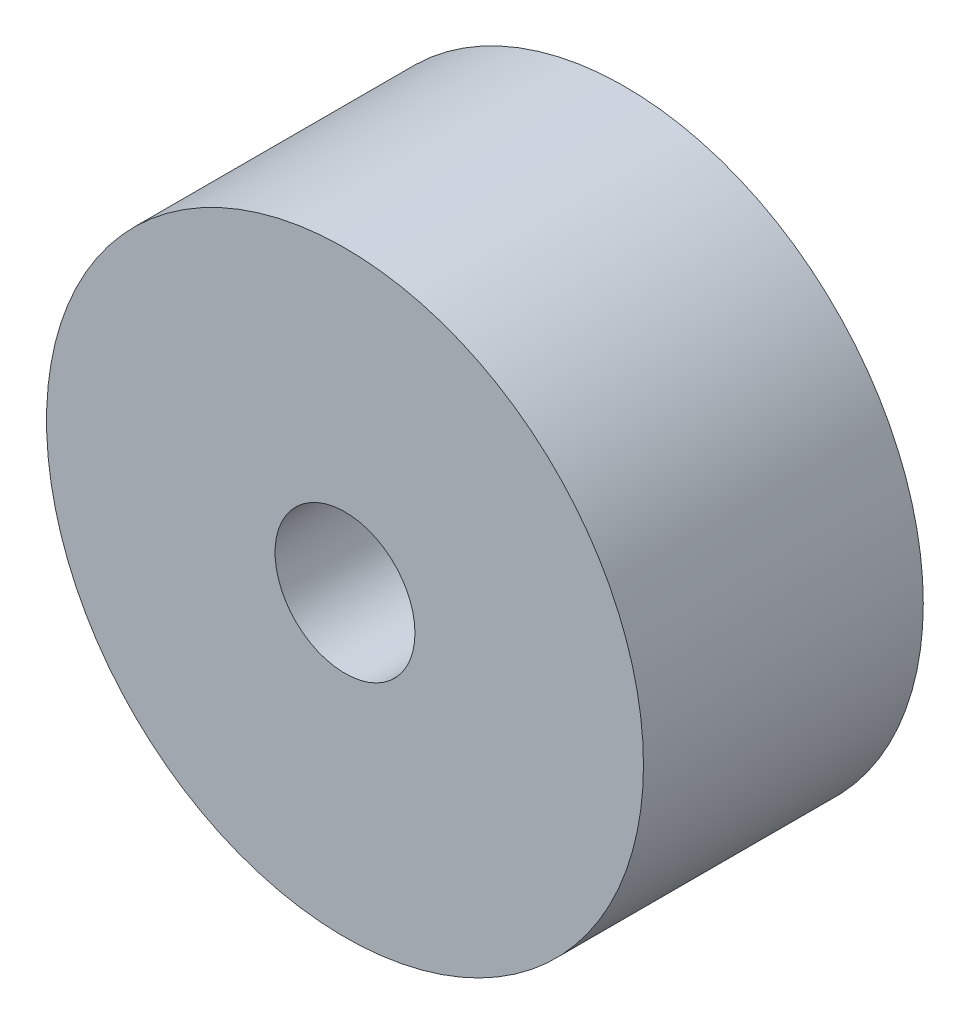
ISO-10303-21;
HEADER;
FILE_DESCRIPTION(('STEP AP214'),'2;1');
FILE_NAME('part.step','',(''),(''),'','','');
FILE_SCHEMA(('AUTOMOTIVE_DESIGN { 1 0 10303 214 1 1 1 1 }'));
ENDSEC;
DATA;
#1=APPLICATION_CONTEXT('core data for automotive mechanical design processes');
#2=APPLICATION_PROTOCOL_DEFINITION('international standard','automotive_design',2000,#1);
#3=PRODUCT_CONTEXT('',#1,'mechanical');
#4=PRODUCT('Part','Part','',(#3));
#5=PRODUCT_RELATED_PRODUCT_CATEGORY('part','',(#4));
#6=PRODUCT_DEFINITION_FORMATION('','',#4);
#7=PRODUCT_DEFINITION_CONTEXT('part definition',#1,'design');
#8=PRODUCT_DEFINITION('design','',#6,#7);
#9=PRODUCT_DEFINITION_SHAPE('','',#8);
#10=(LENGTH_UNIT() NAMED_UNIT(*) SI_UNIT(.MILLI.,.METRE.));
#11=(NAMED_UNIT(*) PLANE_ANGLE_UNIT() SI_UNIT($,.RADIAN.));
#12=(NAMED_UNIT(*) SI_UNIT($,.STERADIAN.) SOLID_ANGLE_UNIT());
#13=UNCERTAINTY_MEASURE_WITH_UNIT(LENGTH_MEASURE(1.E-05),#10,'distance_accuracy_value','');
#14=(GEOMETRIC_REPRESENTATION_CONTEXT(3) GLOBAL_UNCERTAINTY_ASSIGNED_CONTEXT((#13)) GLOBAL_UNIT_ASSIGNED_CONTEXT((#10,
#11,#12)) REPRESENTATION_CONTEXT('',''));
#15=CARTESIAN_POINT('',(0.,0.,0.));
#16=DIRECTION('',(0.,0.,1.));
#17=DIRECTION('',(1.,0.,0.));
#18=AXIS2_PLACEMENT_3D('',#15,#16,#17);
#19=CARTESIAN_POINT('',(0.,0.,300.));
#20=DIRECTION('',(0.,0.,1.));
#21=DIRECTION('',(1.,0.,0.));
#22=AXIS2_PLACEMENT_3D('',#19,#20,#21);
#23=PLANE('',#22);
#24=CARTESIAN_POINT('',(0.,0.,300.));
#25=DIRECTION('',(0.,0.,1.));
#26=DIRECTION('',(1.,0.,0.));
#27=AXIS2_PLACEMENT_3D('',#24,#25,#26);
#28=CIRCLE('',#27,320.);
#29=CARTESIAN_POINT('',(320.,0.,300.));
#30=VERTEX_POINT('',#29);
#31=EDGE_CURVE('E10',#30,#30,#28,.T.);
#32=ORIENTED_EDGE('',*,*,#31,.T.);
#33=EDGE_LOOP('',(#32));
#34=FACE_BOUND('',#33,.T.);
#35=CARTESIAN_POINT('',(0.,0.,300.));
#36=DIRECTION('',(0.,0.,1.));
#37=DIRECTION('',(1.,0.,0.));
#38=AXIS2_PLACEMENT_3D('',#35,#36,#37);
#39=CIRCLE('',#38,75.);
#40=CARTESIAN_POINT('',(75.,0.,300.));
#41=VERTEX_POINT('',#40);
#42=EDGE_CURVE('E50',#41,#41,#39,.T.);
#43=ORIENTED_EDGE('',*,*,#42,.F.);
#44=EDGE_LOOP('',(#43));
#45=FACE_BOUND('',#44,.T.);
#46=ADVANCED_FACE('F37',(#34,#45),#23,.T.);
#47=CARTESIAN_POINT('',(0.,0.,0.));
#48=DIRECTION('',(0.,0.,1.));
#49=DIRECTION('',(1.,0.,0.));
#50=AXIS2_PLACEMENT_3D('',#47,#48,#49);
#51=PLANE('',#50);
#52=CARTESIAN_POINT('',(0.,0.,0.));
#53=DIRECTION('',(0.,0.,1.));
#54=DIRECTION('',(1.,0.,0.));
#55=AXIS2_PLACEMENT_3D('',#52,#53,#54);
#56=CIRCLE('',#55,320.);
#57=CARTESIAN_POINT('',(320.,0.,0.));
#58=VERTEX_POINT('',#57);
#59=EDGE_CURVE('E41',#58,#58,#56,.T.);
#60=ORIENTED_EDGE('',*,*,#59,.F.);
#61=EDGE_LOOP('',(#60));
#62=FACE_BOUND('',#61,.T.);
#63=CARTESIAN_POINT('',(0.,0.,0.));
#64=DIRECTION('',(0.,0.,1.));
#65=DIRECTION('',(1.,0.,0.));
#66=AXIS2_PLACEMENT_3D('',#63,#64,#65);
#67=CIRCLE('',#66,75.);
#68=CARTESIAN_POINT('',(75.,0.,0.));
#69=VERTEX_POINT('',#68);
#70=EDGE_CURVE('E52',#69,#69,#67,.T.);
#71=ORIENTED_EDGE('',*,*,#70,.T.);
#72=EDGE_LOOP('',(#71));
#73=FACE_BOUND('',#72,.T.);
#74=ADVANCED_FACE('F64',(#62,#73),#51,.F.);
#75=CARTESIAN_POINT('',(0.,0.,300.));
#76=DIRECTION('',(0.,0.,-1.));
#77=DIRECTION('',(-1.,0.,0.));
#78=AXIS2_PLACEMENT_3D('',#75,#76,#77);
#79=CYLINDRICAL_SURFACE('',#78,320.);
#80=ORIENTED_EDGE('',*,*,#31,.F.);
#81=EDGE_LOOP('',(#80));
#82=FACE_BOUND('',#81,.T.);
#83=ORIENTED_EDGE('',*,*,#59,.T.);
#84=EDGE_LOOP('',(#83));
#85=FACE_BOUND('',#84,.T.);
#86=ADVANCED_FACE('F39',(#82,#85),#79,.T.);
#87=CARTESIAN_POINT('',(0.,0.,300.));
#88=DIRECTION('',(0.,0.,-1.));
#89=DIRECTION('',(-1.,0.,0.));
#90=AXIS2_PLACEMENT_3D('',#87,#88,#89);
#91=CYLINDRICAL_SURFACE('',#90,75.);
#92=ORIENTED_EDGE('',*,*,#42,.T.);
#93=EDGE_LOOP('',(#92));
#94=FACE_BOUND('',#93,.T.);
#95=ORIENTED_EDGE('',*,*,#70,.F.);
#96=EDGE_LOOP('',(#95));
#97=FACE_BOUND('',#96,.T.);
#98=ADVANCED_FACE('F60',(#94,#97),#91,.F.);
#99=CLOSED_SHELL('',(#46,#74,#86,#98));
#100=MANIFOLD_SOLID_BREP('B2',#99);
#101=ADVANCED_BREP_SHAPE_REPRESENTATION('',(#18,#100),#14);
#102=SHAPE_DEFINITION_REPRESENTATION(#9,#101);
ENDSEC;
END-ISO-10303-21;
